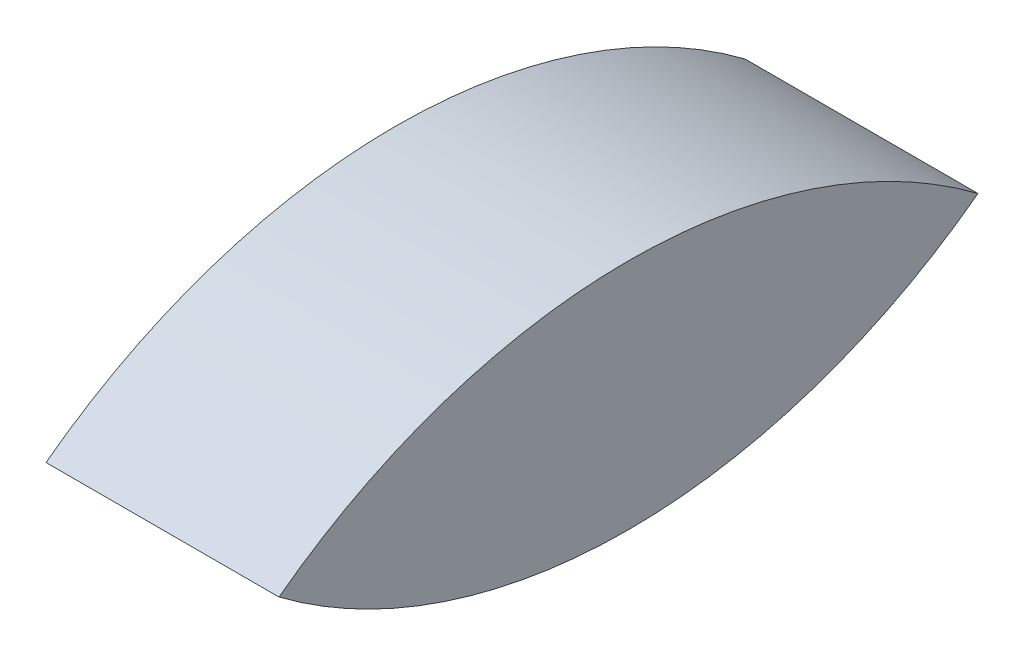
ISO-10303-21;
HEADER;
FILE_DESCRIPTION(('STEP AP214'),'2;1');
FILE_NAME('part.step','',(''),(''),'','','');
FILE_SCHEMA(('AUTOMOTIVE_DESIGN { 1 0 10303 214 1 1 1 1 }'));
ENDSEC;
DATA;
#1=APPLICATION_CONTEXT('core data for automotive mechanical design processes');
#2=APPLICATION_PROTOCOL_DEFINITION('international standard','automotive_design',2000,#1);
#3=PRODUCT_CONTEXT('',#1,'mechanical');
#4=PRODUCT('Part','Part','',(#3));
#5=PRODUCT_RELATED_PRODUCT_CATEGORY('part','',(#4));
#6=PRODUCT_DEFINITION_FORMATION('','',#4);
#7=PRODUCT_DEFINITION_CONTEXT('part definition',#1,'design');
#8=PRODUCT_DEFINITION('design','',#6,#7);
#9=PRODUCT_DEFINITION_SHAPE('','',#8);
#10=(LENGTH_UNIT() NAMED_UNIT(*) SI_UNIT(.MILLI.,.METRE.));
#11=(NAMED_UNIT(*) PLANE_ANGLE_UNIT() SI_UNIT($,.RADIAN.));
#12=(NAMED_UNIT(*) SI_UNIT($,.STERADIAN.) SOLID_ANGLE_UNIT());
#13=UNCERTAINTY_MEASURE_WITH_UNIT(LENGTH_MEASURE(1.E-05),#10,'distance_accuracy_value','');
#14=(GEOMETRIC_REPRESENTATION_CONTEXT(3) GLOBAL_UNCERTAINTY_ASSIGNED_CONTEXT((#13)) GLOBAL_UNIT_ASSIGNED_CONTEXT((#10,
#11,#12)) REPRESENTATION_CONTEXT('',''));
#15=CARTESIAN_POINT('',(0.,0.,0.));
#16=DIRECTION('',(0.,0.,1.));
#17=DIRECTION('',(1.,0.,0.));
#18=AXIS2_PLACEMENT_3D('',#15,#16,#17);
#19=CARTESIAN_POINT('',(5.,20.0000000000001,-15.));
#20=DIRECTION('',(-1.,0.,0.));
#21=DIRECTION('',(0.,0.,1.));
#22=AXIS2_PLACEMENT_3D('',#19,#20,#21);
#23=CYLINDRICAL_SURFACE('',#22,25.0000000000001);
#24=CARTESIAN_POINT('',(-5.,20.0000000000001,-15.));
#25=DIRECTION('',(1.,0.,0.));
#26=DIRECTION('',(0.,0.,-1.));
#27=AXIS2_PLACEMENT_3D('',#24,#25,#26);
#28=CIRCLE('',#27,25.0000000000001);
#29=CARTESIAN_POINT('',(-5.,0.,0.));
#30=VERTEX_POINT('',#29);
#31=CARTESIAN_POINT('',(-5.,0.,-30.));
#32=VERTEX_POINT('',#31);
#33=EDGE_CURVE('E72',#30,#32,#28,.T.);
#34=ORIENTED_EDGE('',*,*,#33,.T.);
#35=DIRECTION('',(-1.,0.,0.));
#36=VECTOR('',#35,1.);
#37=CARTESIAN_POINT('',(5.,0.,-30.));
#38=LINE('',#37,#36);
#39=CARTESIAN_POINT('',(5.,0.,-30.));
#40=VERTEX_POINT('',#39);
#41=EDGE_CURVE('E11',#40,#32,#38,.T.);
#42=ORIENTED_EDGE('',*,*,#41,.F.);
#43=CARTESIAN_POINT('',(5.,20.0000000000001,-15.));
#44=DIRECTION('',(1.,0.,0.));
#45=DIRECTION('',(0.,0.,-1.));
#46=AXIS2_PLACEMENT_3D('',#43,#44,#45);
#47=CIRCLE('',#46,25.0000000000001);
#48=CARTESIAN_POINT('',(5.,0.,0.));
#49=VERTEX_POINT('',#48);
#50=EDGE_CURVE('E71',#49,#40,#47,.T.);
#51=ORIENTED_EDGE('',*,*,#50,.F.);
#52=DIRECTION('',(-1.,0.,0.));
#53=VECTOR('',#52,1.);
#54=CARTESIAN_POINT('',(5.,0.,0.));
#55=LINE('',#54,#53);
#56=EDGE_CURVE('E49',#49,#30,#55,.T.);
#57=ORIENTED_EDGE('',*,*,#56,.T.);
#58=EDGE_LOOP('',(#34,#42,#51,#57));
#59=FACE_BOUND('',#58,.T.);
#60=ADVANCED_FACE('F41',(#59),#23,.T.);
#61=CARTESIAN_POINT('',(5.,-20.0000000000001,-15.));
#62=DIRECTION('',(-1.,0.,0.));
#63=DIRECTION('',(0.,0.,1.));
#64=AXIS2_PLACEMENT_3D('',#61,#62,#63);
#65=CYLINDRICAL_SURFACE('',#64,25.0000000000001);
#66=CARTESIAN_POINT('',(-5.,-20.0000000000001,-15.));
#67=DIRECTION('',(1.,0.,0.));
#68=DIRECTION('',(0.,0.,1.));
#69=AXIS2_PLACEMENT_3D('',#66,#67,#68);
#70=CIRCLE('',#69,25.0000000000001);
#71=EDGE_CURVE('E64',#32,#30,#70,.T.);
#72=ORIENTED_EDGE('',*,*,#71,.T.);
#73=ORIENTED_EDGE('',*,*,#56,.F.);
#74=CARTESIAN_POINT('',(5.,-20.0000000000001,-15.));
#75=DIRECTION('',(1.,0.,0.));
#76=DIRECTION('',(0.,0.,1.));
#77=AXIS2_PLACEMENT_3D('',#74,#75,#76);
#78=CIRCLE('',#77,25.0000000000001);
#79=EDGE_CURVE('E56',#40,#49,#78,.T.);
#80=ORIENTED_EDGE('',*,*,#79,.F.);
#81=ORIENTED_EDGE('',*,*,#41,.T.);
#82=EDGE_LOOP('',(#72,#73,#80,#81));
#83=FACE_BOUND('',#82,.T.);
#84=ADVANCED_FACE('F67',(#83),#65,.T.);
#85=CARTESIAN_POINT('',(5.,0.,-15.));
#86=DIRECTION('',(1.,0.,0.));
#87=DIRECTION('',(0.,0.,-1.));
#88=AXIS2_PLACEMENT_3D('',#85,#86,#87);
#89=PLANE('',#88);
#90=ORIENTED_EDGE('',*,*,#50,.T.);
#91=ORIENTED_EDGE('',*,*,#79,.T.);
#92=EDGE_LOOP('',(#90,#91));
#93=FACE_BOUND('',#92,.T.);
#94=ADVANCED_FACE('F79',(#93),#89,.T.);
#95=CARTESIAN_POINT('',(-5.,0.,-15.));
#96=DIRECTION('',(1.,0.,0.));
#97=DIRECTION('',(0.,0.,-1.));
#98=AXIS2_PLACEMENT_3D('',#95,#96,#97);
#99=PLANE('',#98);
#100=ORIENTED_EDGE('',*,*,#33,.F.);
#101=ORIENTED_EDGE('',*,*,#71,.F.);
#102=EDGE_LOOP('',(#100,#101));
#103=FACE_BOUND('',#102,.T.);
#104=ADVANCED_FACE('F75',(#103),#99,.F.);
#105=CLOSED_SHELL('',(#60,#84,#94,#104));
#106=MANIFOLD_SOLID_BREP('B2',#105);
#107=ADVANCED_BREP_SHAPE_REPRESENTATION('',(#18,#106),#14);
#108=SHAPE_DEFINITION_REPRESENTATION(#9,#107);
ENDSEC;
END-ISO-10303-21;
